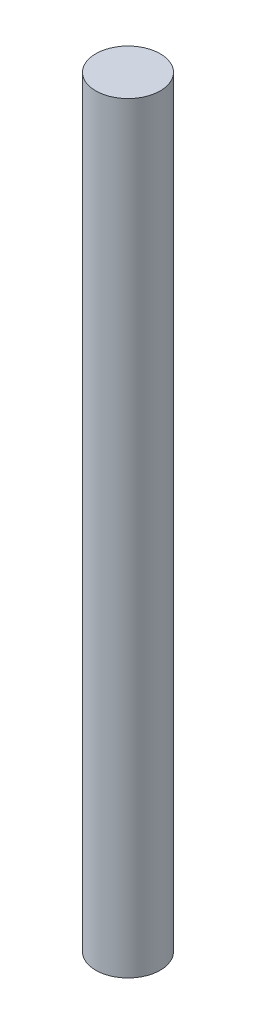
ISO-10303-21;
HEADER;
FILE_DESCRIPTION(('STEP AP214'),'2;1');
FILE_NAME('part.step','',(''),(''),'','','');
FILE_SCHEMA(('AUTOMOTIVE_DESIGN { 1 0 10303 214 1 1 1 1 }'));
ENDSEC;
DATA;
#1=APPLICATION_CONTEXT('core data for automotive mechanical design processes');
#2=APPLICATION_PROTOCOL_DEFINITION('international standard','automotive_design',2000,#1);
#3=PRODUCT_CONTEXT('',#1,'mechanical');
#4=PRODUCT('Part','Part','',(#3));
#5=PRODUCT_RELATED_PRODUCT_CATEGORY('part','',(#4));
#6=PRODUCT_DEFINITION_FORMATION('','',#4);
#7=PRODUCT_DEFINITION_CONTEXT('part definition',#1,'design');
#8=PRODUCT_DEFINITION('design','',#6,#7);
#9=PRODUCT_DEFINITION_SHAPE('','',#8);
#10=(LENGTH_UNIT() NAMED_UNIT(*) SI_UNIT(.MILLI.,.METRE.));
#11=(NAMED_UNIT(*) PLANE_ANGLE_UNIT() SI_UNIT($,.RADIAN.));
#12=(NAMED_UNIT(*) SI_UNIT($,.STERADIAN.) SOLID_ANGLE_UNIT());
#13=UNCERTAINTY_MEASURE_WITH_UNIT(LENGTH_MEASURE(1.E-05),#10,'distance_accuracy_value','');
#14=(GEOMETRIC_REPRESENTATION_CONTEXT(3) GLOBAL_UNCERTAINTY_ASSIGNED_CONTEXT((#13)) GLOBAL_UNIT_ASSIGNED_CONTEXT((#10,
#11,#12)) REPRESENTATION_CONTEXT('',''));
#15=CARTESIAN_POINT('',(0.,0.,0.));
#16=DIRECTION('',(0.,0.,1.));
#17=DIRECTION('',(1.,0.,0.));
#18=AXIS2_PLACEMENT_3D('',#15,#16,#17);
#19=CARTESIAN_POINT('',(0.,532.,0.));
#20=DIRECTION('',(0.,-1.,0.));
#21=DIRECTION('',(0.,0.,-1.));
#22=AXIS2_PLACEMENT_3D('',#19,#20,#21);
#23=CYLINDRICAL_SURFACE('',#22,22.5);
#24=CARTESIAN_POINT('',(0.,532.,0.));
#25=DIRECTION('',(0.,1.,0.));
#26=DIRECTION('',(0.,0.,1.));
#27=AXIS2_PLACEMENT_3D('',#24,#25,#26);
#28=CIRCLE('',#27,22.5);
#29=CARTESIAN_POINT('',(0.,532.,22.5));
#30=VERTEX_POINT('',#29);
#31=EDGE_CURVE('E12',#30,#30,#28,.T.);
#32=ORIENTED_EDGE('',*,*,#31,.F.);
#33=EDGE_LOOP('',(#32));
#34=FACE_BOUND('',#33,.T.);
#35=CARTESIAN_POINT('',(0.,0.,0.));
#36=DIRECTION('',(0.,1.,0.));
#37=DIRECTION('',(0.,0.,1.));
#38=AXIS2_PLACEMENT_3D('',#35,#36,#37);
#39=CIRCLE('',#38,22.5);
#40=CARTESIAN_POINT('',(0.,0.,22.5));
#41=VERTEX_POINT('',#40);
#42=EDGE_CURVE('E45',#41,#41,#39,.T.);
#43=ORIENTED_EDGE('',*,*,#42,.T.);
#44=EDGE_LOOP('',(#43));
#45=FACE_BOUND('',#44,.T.);
#46=ADVANCED_FACE('F42',(#34,#45),#23,.T.);
#47=CARTESIAN_POINT('',(0.,532.,0.));
#48=DIRECTION('',(0.,1.,0.));
#49=DIRECTION('',(0.,0.,1.));
#50=AXIS2_PLACEMENT_3D('',#47,#48,#49);
#51=PLANE('',#50);
#52=ORIENTED_EDGE('',*,*,#31,.T.);
#53=EDGE_LOOP('',(#52));
#54=FACE_BOUND('',#53,.T.);
#55=ADVANCED_FACE('F61',(#54),#51,.T.);
#56=CARTESIAN_POINT('',(0.,0.,0.));
#57=DIRECTION('',(0.,1.,0.));
#58=DIRECTION('',(0.,0.,1.));
#59=AXIS2_PLACEMENT_3D('',#56,#57,#58);
#60=PLANE('',#59);
#61=ORIENTED_EDGE('',*,*,#42,.F.);
#62=EDGE_LOOP('',(#61));
#63=FACE_BOUND('',#62,.T.);
#64=ADVANCED_FACE('F59',(#63),#60,.F.);
#65=CLOSED_SHELL('',(#46,#55,#64));
#66=MANIFOLD_SOLID_BREP('B2',#65);
#67=ADVANCED_BREP_SHAPE_REPRESENTATION('',(#18,#66),#14);
#68=SHAPE_DEFINITION_REPRESENTATION(#9,#67);
ENDSEC;
END-ISO-10303-21;
